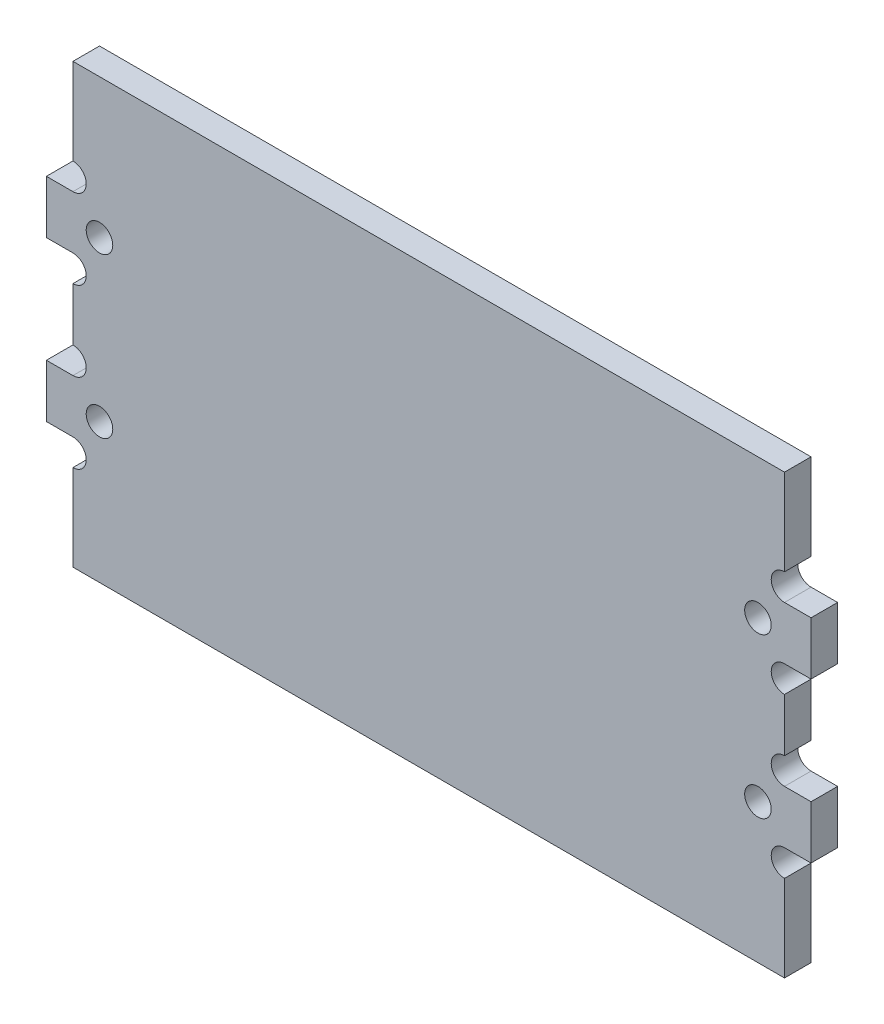
ISO-10303-21;
HEADER;
FILE_DESCRIPTION(('STEP AP214'),'2;1');
FILE_NAME('part.step','',(''),(''),'','','');
FILE_SCHEMA(('AUTOMOTIVE_DESIGN { 1 0 10303 214 1 1 1 1 }'));
ENDSEC;
DATA;
#1=APPLICATION_CONTEXT('core data for automotive mechanical design processes');
#2=APPLICATION_PROTOCOL_DEFINITION('international standard','automotive_design',2000,#1);
#3=PRODUCT_CONTEXT('',#1,'mechanical');
#4=PRODUCT('Part','Part','',(#3));
#5=PRODUCT_RELATED_PRODUCT_CATEGORY('part','',(#4));
#6=PRODUCT_DEFINITION_FORMATION('','',#4);
#7=PRODUCT_DEFINITION_CONTEXT('part definition',#1,'design');
#8=PRODUCT_DEFINITION('design','',#6,#7);
#9=PRODUCT_DEFINITION_SHAPE('','',#8);
#10=(LENGTH_UNIT() NAMED_UNIT(*) SI_UNIT(.MILLI.,.METRE.));
#11=(NAMED_UNIT(*) PLANE_ANGLE_UNIT() SI_UNIT($,.RADIAN.));
#12=(NAMED_UNIT(*) SI_UNIT($,.STERADIAN.) SOLID_ANGLE_UNIT());
#13=UNCERTAINTY_MEASURE_WITH_UNIT(LENGTH_MEASURE(1.E-05),#10,'distance_accuracy_value','');
#14=(GEOMETRIC_REPRESENTATION_CONTEXT(3) GLOBAL_UNCERTAINTY_ASSIGNED_CONTEXT((#13)) GLOBAL_UNIT_ASSIGNED_CONTEXT((#10,
#11,#12)) REPRESENTATION_CONTEXT('',''));
#15=CARTESIAN_POINT('',(0.,0.,0.));
#16=DIRECTION('',(0.,0.,1.));
#17=DIRECTION('',(1.,0.,0.));
#18=AXIS2_PLACEMENT_3D('',#15,#16,#17);
#19=CARTESIAN_POINT('',(-29.1615627590224,11.8479591836735,2.));
#20=DIRECTION('',(0.,0.,1.));
#21=DIRECTION('',(1.,0.,0.));
#22=AXIS2_PLACEMENT_3D('',#19,#20,#21);
#23=PLANE('',#22);
#24=CARTESIAN_POINT('',(-27.1615627590224,-3.15204081632653,2.));
#25=DIRECTION('',(0.,0.,1.));
#26=DIRECTION('',(1.,0.,0.));
#27=AXIS2_PLACEMENT_3D('',#24,#25,#26);
#28=CIRCLE('',#27,1.);
#29=CARTESIAN_POINT('',(-26.1615627590224,-3.15204081632653,2.));
#30=VERTEX_POINT('',#29);
#31=EDGE_CURVE('E815',#30,#30,#28,.T.);
#32=ORIENTED_EDGE('',*,*,#31,.F.);
#33=EDGE_LOOP('',(#32));
#34=FACE_BOUND('',#33,.T.);
#35=CARTESIAN_POINT('',(22.4384372409776,8.84795918367347,2.));
#36=DIRECTION('',(0.,0.,1.));
#37=DIRECTION('',(1.,0.,0.));
#38=AXIS2_PLACEMENT_3D('',#35,#36,#37);
#39=CIRCLE('',#38,1.);
#40=CARTESIAN_POINT('',(23.4384372409776,8.84795918367347,2.));
#41=VERTEX_POINT('',#40);
#42=EDGE_CURVE('E251',#41,#41,#39,.T.);
#43=ORIENTED_EDGE('',*,*,#42,.F.);
#44=EDGE_LOOP('',(#43));
#45=FACE_BOUND('',#44,.T.);
#46=DIRECTION('',(0.,-1.,0.));
#47=VECTOR('',#46,1.);
#48=CARTESIAN_POINT('',(-29.1615627590224,19.3479591836735,2.));
#49=LINE('',#48,#47);
#50=CARTESIAN_POINT('',(-29.1615627590224,19.3479591836735,2.));
#51=VERTEX_POINT('',#50);
#52=CARTESIAN_POINT('',(-29.1615627590224,12.8479591836735,2.));
#53=VERTEX_POINT('',#52);
#54=EDGE_CURVE('E146',#51,#53,#49,.T.);
#55=ORIENTED_EDGE('',*,*,#54,.T.);
#56=CARTESIAN_POINT('',(-29.1615627590224,11.8479591836735,2.));
#57=DIRECTION('',(0.,0.,-1.));
#58=DIRECTION('',(1.,0.,0.));
#59=AXIS2_PLACEMENT_3D('',#56,#57,#58);
#60=CIRCLE('',#59,1.);
#61=CARTESIAN_POINT('',(-29.1615627590224,10.8479591836735,2.));
#62=VERTEX_POINT('',#61);
#63=EDGE_CURVE('E455',#53,#62,#60,.T.);
#64=ORIENTED_EDGE('',*,*,#63,.T.);
#65=DIRECTION('',(-1.,0.,0.));
#66=VECTOR('',#65,1.);
#67=CARTESIAN_POINT('',(-29.1615627590224,10.8479591836735,2.));
#68=LINE('',#67,#66);
#69=CARTESIAN_POINT('',(-31.1615627590224,10.8479591836735,2.));
#70=VERTEX_POINT('',#69);
#71=EDGE_CURVE('E382',#62,#70,#68,.T.);
#72=ORIENTED_EDGE('',*,*,#71,.T.);
#73=DIRECTION('',(0.,-1.,0.));
#74=VECTOR('',#73,1.);
#75=CARTESIAN_POINT('',(-31.1615627590224,10.8479591836735,2.));
#76=LINE('',#75,#74);
#77=CARTESIAN_POINT('',(-31.1615627590224,6.84795918367347,2.));
#78=VERTEX_POINT('',#77);
#79=EDGE_CURVE('E401',#70,#78,#76,.T.);
#80=ORIENTED_EDGE('',*,*,#79,.T.);
#81=DIRECTION('',(1.,0.,0.));
#82=VECTOR('',#81,1.);
#83=CARTESIAN_POINT('',(-29.1615627590224,6.84795918367347,2.));
#84=LINE('',#83,#82);
#85=CARTESIAN_POINT('',(-29.1615627590224,6.84795918367347,2.));
#86=VERTEX_POINT('',#85);
#87=EDGE_CURVE('E398',#78,#86,#84,.T.);
#88=ORIENTED_EDGE('',*,*,#87,.T.);
#89=CARTESIAN_POINT('',(-29.1615627590224,5.84795918367347,2.));
#90=DIRECTION('',(0.,0.,-1.));
#91=DIRECTION('',(-1.,0.,0.));
#92=AXIS2_PLACEMENT_3D('',#89,#90,#91);
#93=CIRCLE('',#92,1.);
#94=CARTESIAN_POINT('',(-29.1615627590224,4.84795918367347,2.));
#95=VERTEX_POINT('',#94);
#96=EDGE_CURVE('E400',#86,#95,#93,.T.);
#97=ORIENTED_EDGE('',*,*,#96,.T.);
#98=DIRECTION('',(0.,-1.,0.));
#99=VECTOR('',#98,1.);
#100=CARTESIAN_POINT('',(-29.1615627590224,4.84795918367347,2.));
#101=LINE('',#100,#99);
#102=CARTESIAN_POINT('',(-29.1615627590224,0.847959183673475,2.));
#103=VERTEX_POINT('',#102);
#104=EDGE_CURVE('E403',#95,#103,#101,.T.);
#105=ORIENTED_EDGE('',*,*,#104,.T.);
#106=CARTESIAN_POINT('',(-29.1615627590224,-0.152040816326526,2.));
#107=DIRECTION('',(0.,0.,-1.));
#108=DIRECTION('',(1.,0.,0.));
#109=AXIS2_PLACEMENT_3D('',#106,#107,#108);
#110=CIRCLE('',#109,1.);
#111=CARTESIAN_POINT('',(-29.1615627590224,-1.15204081632653,2.));
#112=VERTEX_POINT('',#111);
#113=EDGE_CURVE('E409',#103,#112,#110,.T.);
#114=ORIENTED_EDGE('',*,*,#113,.T.);
#115=DIRECTION('',(-1.,0.,0.));
#116=VECTOR('',#115,1.);
#117=CARTESIAN_POINT('',(-29.1615627590224,-1.15204081632653,2.));
#118=LINE('',#117,#116);
#119=CARTESIAN_POINT('',(-31.1615627590224,-1.15204081632653,2.));
#120=VERTEX_POINT('',#119);
#121=EDGE_CURVE('E411',#112,#120,#118,.T.);
#122=ORIENTED_EDGE('',*,*,#121,.T.);
#123=DIRECTION('',(0.,-1.,0.));
#124=VECTOR('',#123,1.);
#125=CARTESIAN_POINT('',(-31.1615627590224,-1.15204081632653,2.));
#126=LINE('',#125,#124);
#127=CARTESIAN_POINT('',(-31.1615627590224,-5.15204081632653,2.));
#128=VERTEX_POINT('',#127);
#129=EDGE_CURVE('E413',#120,#128,#126,.T.);
#130=ORIENTED_EDGE('',*,*,#129,.T.);
#131=DIRECTION('',(1.,0.,0.));
#132=VECTOR('',#131,1.);
#133=CARTESIAN_POINT('',(-29.1615627590224,-5.15204081632653,2.));
#134=LINE('',#133,#132);
#135=CARTESIAN_POINT('',(-29.1615627590224,-5.15204081632653,2.));
#136=VERTEX_POINT('',#135);
#137=EDGE_CURVE('E415',#128,#136,#134,.T.);
#138=ORIENTED_EDGE('',*,*,#137,.T.);
#139=CARTESIAN_POINT('',(-29.1615627590224,-6.15204081632653,2.));
#140=DIRECTION('',(0.,0.,-1.));
#141=DIRECTION('',(-1.,0.,0.));
#142=AXIS2_PLACEMENT_3D('',#139,#140,#141);
#143=CIRCLE('',#142,1.);
#144=CARTESIAN_POINT('',(-29.1615627590224,-7.15204081632653,2.));
#145=VERTEX_POINT('',#144);
#146=EDGE_CURVE('E417',#136,#145,#143,.T.);
#147=ORIENTED_EDGE('',*,*,#146,.T.);
#148=DIRECTION('',(0.,-1.,0.));
#149=VECTOR('',#148,1.);
#150=CARTESIAN_POINT('',(-29.1615627590224,-7.15204081632653,2.));
#151=LINE('',#150,#149);
#152=CARTESIAN_POINT('',(-29.1615627590224,-13.6520408163265,2.));
#153=VERTEX_POINT('',#152);
#154=EDGE_CURVE('E419',#145,#153,#151,.T.);
#155=ORIENTED_EDGE('',*,*,#154,.T.);
#156=DIRECTION('',(1.,0.,0.));
#157=VECTOR('',#156,1.);
#158=CARTESIAN_POINT('',(-29.1615627590224,-13.6520408163265,2.));
#159=LINE('',#158,#157);
#160=CARTESIAN_POINT('',(24.4384372409776,-13.6520408163265,2.));
#161=VERTEX_POINT('',#160);
#162=EDGE_CURVE('E421',#153,#161,#159,.T.);
#163=ORIENTED_EDGE('',*,*,#162,.T.);
#164=DIRECTION('',(0.,1.,0.));
#165=VECTOR('',#164,1.);
#166=CARTESIAN_POINT('',(24.4384372409776,-12.6520408163265,2.));
#167=LINE('',#166,#165);
#168=CARTESIAN_POINT('',(24.4384372409776,-7.15204081632653,2.));
#169=VERTEX_POINT('',#168);
#170=EDGE_CURVE('E423',#161,#169,#167,.T.);
#171=ORIENTED_EDGE('',*,*,#170,.T.);
#172=CARTESIAN_POINT('',(24.4384372409776,-6.15204081632653,2.));
#173=DIRECTION('',(0.,0.,-1.));
#174=DIRECTION('',(1.,0.,0.));
#175=AXIS2_PLACEMENT_3D('',#172,#173,#174);
#176=CIRCLE('',#175,1.);
#177=CARTESIAN_POINT('',(24.4384372409776,-5.15204081632653,2.));
#178=VERTEX_POINT('',#177);
#179=EDGE_CURVE('E425',#169,#178,#176,.T.);
#180=ORIENTED_EDGE('',*,*,#179,.T.);
#181=DIRECTION('',(1.,0.,0.));
#182=VECTOR('',#181,1.);
#183=CARTESIAN_POINT('',(24.4384372409776,-5.15204081632653,2.));
#184=LINE('',#183,#182);
#185=CARTESIAN_POINT('',(26.4384372409776,-5.15204081632653,2.));
#186=VERTEX_POINT('',#185);
#187=EDGE_CURVE('E427',#178,#186,#184,.T.);
#188=ORIENTED_EDGE('',*,*,#187,.T.);
#189=DIRECTION('',(0.,1.,0.));
#190=VECTOR('',#189,1.);
#191=CARTESIAN_POINT('',(26.4384372409776,-1.15204081632653,2.));
#192=LINE('',#191,#190);
#193=CARTESIAN_POINT('',(26.4384372409776,-1.15204081632653,2.));
#194=VERTEX_POINT('',#193);
#195=EDGE_CURVE('E429',#186,#194,#192,.T.);
#196=ORIENTED_EDGE('',*,*,#195,.T.);
#197=DIRECTION('',(-1.,0.,0.));
#198=VECTOR('',#197,1.);
#199=CARTESIAN_POINT('',(24.4384372409776,-1.15204081632653,2.));
#200=LINE('',#199,#198);
#201=CARTESIAN_POINT('',(24.4384372409776,-1.15204081632653,2.));
#202=VERTEX_POINT('',#201);
#203=EDGE_CURVE('E431',#194,#202,#200,.T.);
#204=ORIENTED_EDGE('',*,*,#203,.T.);
#205=CARTESIAN_POINT('',(24.4384372409776,-0.152040816326526,2.));
#206=DIRECTION('',(0.,0.,-1.));
#207=DIRECTION('',(-1.,0.,0.));
#208=AXIS2_PLACEMENT_3D('',#205,#206,#207);
#209=CIRCLE('',#208,1.);
#210=CARTESIAN_POINT('',(24.4384372409776,0.847959183673475,2.));
#211=VERTEX_POINT('',#210);
#212=EDGE_CURVE('E433',#202,#211,#209,.T.);
#213=ORIENTED_EDGE('',*,*,#212,.T.);
#214=DIRECTION('',(0.,1.,0.));
#215=VECTOR('',#214,1.);
#216=CARTESIAN_POINT('',(24.4384372409776,4.84795918367347,2.));
#217=LINE('',#216,#215);
#218=CARTESIAN_POINT('',(24.4384372409776,4.84795918367347,2.));
#219=VERTEX_POINT('',#218);
#220=EDGE_CURVE('E435',#211,#219,#217,.T.);
#221=ORIENTED_EDGE('',*,*,#220,.T.);
#222=CARTESIAN_POINT('',(24.4384372409776,5.84795918367347,2.));
#223=DIRECTION('',(0.,0.,-1.));
#224=DIRECTION('',(1.,0.,0.));
#225=AXIS2_PLACEMENT_3D('',#222,#223,#224);
#226=CIRCLE('',#225,1.);
#227=CARTESIAN_POINT('',(24.4384372409776,6.84795918367347,2.));
#228=VERTEX_POINT('',#227);
#229=EDGE_CURVE('E437',#219,#228,#226,.T.);
#230=ORIENTED_EDGE('',*,*,#229,.T.);
#231=DIRECTION('',(1.,0.,0.));
#232=VECTOR('',#231,1.);
#233=CARTESIAN_POINT('',(24.4384372409776,6.84795918367347,2.));
#234=LINE('',#233,#232);
#235=CARTESIAN_POINT('',(26.4384372409776,6.84795918367347,2.));
#236=VERTEX_POINT('',#235);
#237=EDGE_CURVE('E439',#228,#236,#234,.T.);
#238=ORIENTED_EDGE('',*,*,#237,.T.);
#239=DIRECTION('',(0.,1.,0.));
#240=VECTOR('',#239,1.);
#241=CARTESIAN_POINT('',(26.4384372409776,10.8479591836735,2.));
#242=LINE('',#241,#240);
#243=CARTESIAN_POINT('',(26.4384372409776,10.8479591836735,2.));
#244=VERTEX_POINT('',#243);
#245=EDGE_CURVE('E441',#236,#244,#242,.T.);
#246=ORIENTED_EDGE('',*,*,#245,.T.);
#247=DIRECTION('',(-1.,0.,0.));
#248=VECTOR('',#247,1.);
#249=CARTESIAN_POINT('',(24.4384372409776,10.8479591836735,2.));
#250=LINE('',#249,#248);
#251=CARTESIAN_POINT('',(24.4384372409776,10.8479591836735,2.));
#252=VERTEX_POINT('',#251);
#253=EDGE_CURVE('E227',#244,#252,#250,.T.);
#254=ORIENTED_EDGE('',*,*,#253,.T.);
#255=CARTESIAN_POINT('',(24.4384372409776,11.8479591836735,2.));
#256=DIRECTION('',(0.,0.,-1.));
#257=DIRECTION('',(-1.,0.,0.));
#258=AXIS2_PLACEMENT_3D('',#255,#256,#257);
#259=CIRCLE('',#258,1.);
#260=CARTESIAN_POINT('',(24.4384372409776,12.8479591836735,2.));
#261=VERTEX_POINT('',#260);
#262=EDGE_CURVE('E220',#252,#261,#259,.T.);
#263=ORIENTED_EDGE('',*,*,#262,.T.);
#264=DIRECTION('',(0.,1.,0.));
#265=VECTOR('',#264,1.);
#266=CARTESIAN_POINT('',(24.4384372409776,18.3479591836735,2.));
#267=LINE('',#266,#265);
#268=CARTESIAN_POINT('',(24.4384372409776,19.3479591836735,2.));
#269=VERTEX_POINT('',#268);
#270=EDGE_CURVE('E224',#261,#269,#267,.T.);
#271=ORIENTED_EDGE('',*,*,#270,.T.);
#272=DIRECTION('',(-1.,0.,0.));
#273=VECTOR('',#272,1.);
#274=CARTESIAN_POINT('',(23.4384372409776,19.3479591836735,2.));
#275=LINE('',#274,#273);
#276=EDGE_CURVE('E49',#269,#51,#275,.T.);
#277=ORIENTED_EDGE('',*,*,#276,.T.);
#278=EDGE_LOOP('',(#55,#64,#72,#80,#88,#97,#105,#114,#122,#130,#138,#147,#155,#163,#171,#180,
#188,#196,#204,#213,#221,#230,#238,#246,#254,#263,#271,#277));
#279=FACE_BOUND('',#278,.T.);
#280=CARTESIAN_POINT('',(-27.1615627590224,8.84795918367347,2.));
#281=DIRECTION('',(0.,0.,1.));
#282=DIRECTION('',(1.,0.,0.));
#283=AXIS2_PLACEMENT_3D('',#280,#281,#282);
#284=CIRCLE('',#283,1.);
#285=CARTESIAN_POINT('',(-26.1615627590224,8.84795918367347,2.));
#286=VERTEX_POINT('',#285);
#287=EDGE_CURVE('E821',#286,#286,#284,.T.);
#288=ORIENTED_EDGE('',*,*,#287,.F.);
#289=EDGE_LOOP('',(#288));
#290=FACE_BOUND('',#289,.T.);
#291=CARTESIAN_POINT('',(22.4384372409776,-3.15204081632653,2.));
#292=DIRECTION('',(0.,0.,1.));
#293=DIRECTION('',(1.,0.,0.));
#294=AXIS2_PLACEMENT_3D('',#291,#292,#293);
#295=CIRCLE('',#294,1.);
#296=CARTESIAN_POINT('',(23.4384372409776,-3.15204081632653,2.));
#297=VERTEX_POINT('',#296);
#298=EDGE_CURVE('E806',#297,#297,#295,.T.);
#299=ORIENTED_EDGE('',*,*,#298,.F.);
#300=EDGE_LOOP('',(#299));
#301=FACE_BOUND('',#300,.T.);
#302=ADVANCED_FACE('F32',(#34,#45,#279,#290,#301),#23,.T.);
#303=CARTESIAN_POINT('',(-29.1615627590224,11.8479591836735,0.));
#304=DIRECTION('',(0.,0.,1.));
#305=DIRECTION('',(1.,0.,0.));
#306=AXIS2_PLACEMENT_3D('',#303,#304,#305);
#307=PLANE('',#306);
#308=DIRECTION('',(0.,-1.,0.));
#309=VECTOR('',#308,1.);
#310=CARTESIAN_POINT('',(-29.1615627590224,18.3479591836735,0.));
#311=LINE('',#310,#309);
#312=CARTESIAN_POINT('',(-29.1615627590224,19.3479591836735,0.));
#313=VERTEX_POINT('',#312);
#314=CARTESIAN_POINT('',(-29.1615627590224,12.8479591836735,0.));
#315=VERTEX_POINT('',#314);
#316=EDGE_CURVE('E141',#313,#315,#311,.T.);
#317=ORIENTED_EDGE('',*,*,#316,.F.);
#318=DIRECTION('',(-1.,0.,0.));
#319=VECTOR('',#318,1.);
#320=CARTESIAN_POINT('',(-28.1615627590224,19.3479591836735,0.));
#321=LINE('',#320,#319);
#322=CARTESIAN_POINT('',(24.4384372409776,19.3479591836735,0.));
#323=VERTEX_POINT('',#322);
#324=EDGE_CURVE('E137',#323,#313,#321,.T.);
#325=ORIENTED_EDGE('',*,*,#324,.F.);
#326=DIRECTION('',(0.,1.,0.));
#327=VECTOR('',#326,1.);
#328=CARTESIAN_POINT('',(24.4384372409776,19.3479591836735,0.));
#329=LINE('',#328,#327);
#330=CARTESIAN_POINT('',(24.4384372409776,12.8479591836735,0.));
#331=VERTEX_POINT('',#330);
#332=EDGE_CURVE('E303',#331,#323,#329,.T.);
#333=ORIENTED_EDGE('',*,*,#332,.F.);
#334=CARTESIAN_POINT('',(24.4384372409776,11.8479591836735,0.));
#335=DIRECTION('',(0.,0.,-1.));
#336=DIRECTION('',(-1.,0.,0.));
#337=AXIS2_PLACEMENT_3D('',#334,#335,#336);
#338=CIRCLE('',#337,1.);
#339=CARTESIAN_POINT('',(24.4384372409776,10.8479591836735,0.));
#340=VERTEX_POINT('',#339);
#341=EDGE_CURVE('E237',#340,#331,#338,.T.);
#342=ORIENTED_EDGE('',*,*,#341,.F.);
#343=DIRECTION('',(-1.,0.,0.));
#344=VECTOR('',#343,1.);
#345=CARTESIAN_POINT('',(24.4384372409776,10.8479591836735,0.));
#346=LINE('',#345,#344);
#347=CARTESIAN_POINT('',(26.4384372409776,10.8479591836735,0.));
#348=VERTEX_POINT('',#347);
#349=EDGE_CURVE('E300',#348,#340,#346,.T.);
#350=ORIENTED_EDGE('',*,*,#349,.F.);
#351=DIRECTION('',(0.,1.,0.));
#352=VECTOR('',#351,1.);
#353=CARTESIAN_POINT('',(26.4384372409776,10.8479591836735,0.));
#354=LINE('',#353,#352);
#355=CARTESIAN_POINT('',(26.4384372409776,6.84795918367347,0.));
#356=VERTEX_POINT('',#355);
#357=EDGE_CURVE('E298',#356,#348,#354,.T.);
#358=ORIENTED_EDGE('',*,*,#357,.F.);
#359=DIRECTION('',(1.,0.,0.));
#360=VECTOR('',#359,1.);
#361=CARTESIAN_POINT('',(24.4384372409776,6.84795918367347,0.));
#362=LINE('',#361,#360);
#363=CARTESIAN_POINT('',(24.4384372409776,6.84795918367347,0.));
#364=VERTEX_POINT('',#363);
#365=EDGE_CURVE('E296',#364,#356,#362,.T.);
#366=ORIENTED_EDGE('',*,*,#365,.F.);
#367=CARTESIAN_POINT('',(24.4384372409776,5.84795918367347,0.));
#368=DIRECTION('',(0.,0.,-1.));
#369=DIRECTION('',(1.,0.,0.));
#370=AXIS2_PLACEMENT_3D('',#367,#368,#369);
#371=CIRCLE('',#370,1.);
#372=CARTESIAN_POINT('',(24.4384372409776,4.84795918367347,0.));
#373=VERTEX_POINT('',#372);
#374=EDGE_CURVE('E294',#373,#364,#371,.T.);
#375=ORIENTED_EDGE('',*,*,#374,.F.);
#376=DIRECTION('',(0.,1.,0.));
#377=VECTOR('',#376,1.);
#378=CARTESIAN_POINT('',(24.4384372409776,4.84795918367347,0.));
#379=LINE('',#378,#377);
#380=CARTESIAN_POINT('',(24.4384372409776,0.847959183673475,0.));
#381=VERTEX_POINT('',#380);
#382=EDGE_CURVE('E292',#381,#373,#379,.T.);
#383=ORIENTED_EDGE('',*,*,#382,.F.);
#384=CARTESIAN_POINT('',(24.4384372409776,-0.152040816326526,0.));
#385=DIRECTION('',(0.,0.,-1.));
#386=DIRECTION('',(-1.,0.,0.));
#387=AXIS2_PLACEMENT_3D('',#384,#385,#386);
#388=CIRCLE('',#387,1.);
#389=CARTESIAN_POINT('',(24.4384372409776,-1.15204081632653,0.));
#390=VERTEX_POINT('',#389);
#391=EDGE_CURVE('E290',#390,#381,#388,.T.);
#392=ORIENTED_EDGE('',*,*,#391,.F.);
#393=DIRECTION('',(-1.,0.,0.));
#394=VECTOR('',#393,1.);
#395=CARTESIAN_POINT('',(24.4384372409776,-1.15204081632653,0.));
#396=LINE('',#395,#394);
#397=CARTESIAN_POINT('',(26.4384372409776,-1.15204081632653,0.));
#398=VERTEX_POINT('',#397);
#399=EDGE_CURVE('E288',#398,#390,#396,.T.);
#400=ORIENTED_EDGE('',*,*,#399,.F.);
#401=DIRECTION('',(0.,1.,0.));
#402=VECTOR('',#401,1.);
#403=CARTESIAN_POINT('',(26.4384372409776,-1.15204081632653,0.));
#404=LINE('',#403,#402);
#405=CARTESIAN_POINT('',(26.4384372409776,-5.15204081632653,0.));
#406=VERTEX_POINT('',#405);
#407=EDGE_CURVE('E286',#406,#398,#404,.T.);
#408=ORIENTED_EDGE('',*,*,#407,.F.);
#409=DIRECTION('',(1.,0.,0.));
#410=VECTOR('',#409,1.);
#411=CARTESIAN_POINT('',(24.4384372409776,-5.15204081632653,0.));
#412=LINE('',#411,#410);
#413=CARTESIAN_POINT('',(24.4384372409776,-5.15204081632653,0.));
#414=VERTEX_POINT('',#413);
#415=EDGE_CURVE('E284',#414,#406,#412,.T.);
#416=ORIENTED_EDGE('',*,*,#415,.F.);
#417=CARTESIAN_POINT('',(24.4384372409776,-6.15204081632653,0.));
#418=DIRECTION('',(0.,0.,-1.));
#419=DIRECTION('',(1.,0.,0.));
#420=AXIS2_PLACEMENT_3D('',#417,#418,#419);
#421=CIRCLE('',#420,1.);
#422=CARTESIAN_POINT('',(24.4384372409776,-7.15204081632653,0.));
#423=VERTEX_POINT('',#422);
#424=EDGE_CURVE('E282',#423,#414,#421,.T.);
#425=ORIENTED_EDGE('',*,*,#424,.F.);
#426=DIRECTION('',(0.,1.,0.));
#427=VECTOR('',#426,1.);
#428=CARTESIAN_POINT('',(24.4384372409776,-7.15204081632653,0.));
#429=LINE('',#428,#427);
#430=CARTESIAN_POINT('',(24.4384372409776,-13.6520408163265,0.));
#431=VERTEX_POINT('',#430);
#432=EDGE_CURVE('E280',#431,#423,#429,.T.);
#433=ORIENTED_EDGE('',*,*,#432,.F.);
#434=DIRECTION('',(1.,0.,0.));
#435=VECTOR('',#434,1.);
#436=CARTESIAN_POINT('',(24.4384372409776,-13.6520408163265,0.));
#437=LINE('',#436,#435);
#438=CARTESIAN_POINT('',(-29.1615627590224,-13.6520408163265,0.));
#439=VERTEX_POINT('',#438);
#440=EDGE_CURVE('E277',#439,#431,#437,.T.);
#441=ORIENTED_EDGE('',*,*,#440,.F.);
#442=DIRECTION('',(0.,-1.,0.));
#443=VECTOR('',#442,1.);
#444=CARTESIAN_POINT('',(-29.1615627590224,-12.6520408163265,0.));
#445=LINE('',#444,#443);
#446=CARTESIAN_POINT('',(-29.1615627590224,-7.15204081632653,0.));
#447=VERTEX_POINT('',#446);
#448=EDGE_CURVE('E274',#447,#439,#445,.T.);
#449=ORIENTED_EDGE('',*,*,#448,.F.);
#450=CARTESIAN_POINT('',(-29.1615627590224,-6.15204081632653,0.));
#451=DIRECTION('',(0.,0.,-1.));
#452=DIRECTION('',(-1.,0.,0.));
#453=AXIS2_PLACEMENT_3D('',#450,#451,#452);
#454=CIRCLE('',#453,1.);
#455=CARTESIAN_POINT('',(-29.1615627590224,-5.15204081632653,0.));
#456=VERTEX_POINT('',#455);
#457=EDGE_CURVE('E271',#456,#447,#454,.T.);
#458=ORIENTED_EDGE('',*,*,#457,.F.);
#459=DIRECTION('',(1.,0.,0.));
#460=VECTOR('',#459,1.);
#461=CARTESIAN_POINT('',(-29.1615627590224,-5.15204081632653,0.));
#462=LINE('',#461,#460);
#463=CARTESIAN_POINT('',(-31.1615627590224,-5.15204081632653,0.));
#464=VERTEX_POINT('',#463);
#465=EDGE_CURVE('E269',#464,#456,#462,.T.);
#466=ORIENTED_EDGE('',*,*,#465,.F.);
#467=DIRECTION('',(0.,-1.,0.));
#468=VECTOR('',#467,1.);
#469=CARTESIAN_POINT('',(-31.1615627590224,-1.15204081632653,0.));
#470=LINE('',#469,#468);
#471=CARTESIAN_POINT('',(-31.1615627590224,-1.15204081632653,0.));
#472=VERTEX_POINT('',#471);
#473=EDGE_CURVE('E267',#472,#464,#470,.T.);
#474=ORIENTED_EDGE('',*,*,#473,.F.);
#475=DIRECTION('',(-1.,0.,0.));
#476=VECTOR('',#475,1.);
#477=CARTESIAN_POINT('',(-29.1615627590224,-1.15204081632653,0.));
#478=LINE('',#477,#476);
#479=CARTESIAN_POINT('',(-29.1615627590224,-1.15204081632653,0.));
#480=VERTEX_POINT('',#479);
#481=EDGE_CURVE('E265',#480,#472,#478,.T.);
#482=ORIENTED_EDGE('',*,*,#481,.F.);
#483=CARTESIAN_POINT('',(-29.1615627590224,-0.152040816326526,0.));
#484=DIRECTION('',(0.,0.,-1.));
#485=DIRECTION('',(1.,0.,0.));
#486=AXIS2_PLACEMENT_3D('',#483,#484,#485);
#487=CIRCLE('',#486,1.);
#488=CARTESIAN_POINT('',(-29.1615627590224,0.847959183673475,0.));
#489=VERTEX_POINT('',#488);
#490=EDGE_CURVE('E263',#489,#480,#487,.T.);
#491=ORIENTED_EDGE('',*,*,#490,.F.);
#492=DIRECTION('',(0.,-1.,0.));
#493=VECTOR('',#492,1.);
#494=CARTESIAN_POINT('',(-29.1615627590224,4.84795918367347,0.));
#495=LINE('',#494,#493);
#496=CARTESIAN_POINT('',(-29.1615627590224,4.84795918367347,0.));
#497=VERTEX_POINT('',#496);
#498=EDGE_CURVE('E261',#497,#489,#495,.T.);
#499=ORIENTED_EDGE('',*,*,#498,.F.);
#500=CARTESIAN_POINT('',(-29.1615627590224,5.84795918367347,0.));
#501=DIRECTION('',(0.,0.,-1.));
#502=DIRECTION('',(-1.,0.,0.));
#503=AXIS2_PLACEMENT_3D('',#500,#501,#502);
#504=CIRCLE('',#503,1.);
#505=CARTESIAN_POINT('',(-29.1615627590224,6.84795918367347,0.));
#506=VERTEX_POINT('',#505);
#507=EDGE_CURVE('E259',#506,#497,#504,.T.);
#508=ORIENTED_EDGE('',*,*,#507,.F.);
#509=DIRECTION('',(1.,0.,0.));
#510=VECTOR('',#509,1.);
#511=CARTESIAN_POINT('',(-29.1615627590224,6.84795918367347,0.));
#512=LINE('',#511,#510);
#513=CARTESIAN_POINT('',(-31.1615627590224,6.84795918367347,0.));
#514=VERTEX_POINT('',#513);
#515=EDGE_CURVE('E257',#514,#506,#512,.T.);
#516=ORIENTED_EDGE('',*,*,#515,.F.);
#517=DIRECTION('',(0.,-1.,0.));
#518=VECTOR('',#517,1.);
#519=CARTESIAN_POINT('',(-31.1615627590224,10.8479591836735,0.));
#520=LINE('',#519,#518);
#521=CARTESIAN_POINT('',(-31.1615627590224,10.8479591836735,0.));
#522=VERTEX_POINT('',#521);
#523=EDGE_CURVE('E255',#522,#514,#520,.T.);
#524=ORIENTED_EDGE('',*,*,#523,.F.);
#525=DIRECTION('',(-1.,0.,0.));
#526=VECTOR('',#525,1.);
#527=CARTESIAN_POINT('',(-29.1615627590224,10.8479591836735,0.));
#528=LINE('',#527,#526);
#529=CARTESIAN_POINT('',(-29.1615627590224,10.8479591836735,0.));
#530=VERTEX_POINT('',#529);
#531=EDGE_CURVE('E253',#530,#522,#528,.T.);
#532=ORIENTED_EDGE('',*,*,#531,.F.);
#533=CARTESIAN_POINT('',(-29.1615627590224,11.8479591836735,0.));
#534=DIRECTION('',(0.,0.,-1.));
#535=DIRECTION('',(1.,0.,0.));
#536=AXIS2_PLACEMENT_3D('',#533,#534,#535);
#537=CIRCLE('',#536,1.);
#538=EDGE_CURVE('E250',#315,#530,#537,.T.);
#539=ORIENTED_EDGE('',*,*,#538,.F.);
#540=EDGE_LOOP('',(#317,#325,#333,#342,#350,#358,#366,#375,#383,#392,#400,#408,#416,#425,#433,
#441,#449,#458,#466,#474,#482,#491,#499,#508,#516,#524,#532,#539));
#541=FACE_BOUND('',#540,.T.);
#542=CARTESIAN_POINT('',(22.4384372409776,8.84795918367347,0.));
#543=DIRECTION('',(0.,0.,1.));
#544=DIRECTION('',(1.,0.,0.));
#545=AXIS2_PLACEMENT_3D('',#542,#543,#544);
#546=CIRCLE('',#545,1.);
#547=CARTESIAN_POINT('',(23.4384372409776,8.84795918367347,0.));
#548=VERTEX_POINT('',#547);
#549=EDGE_CURVE('E459',#548,#548,#546,.T.);
#550=ORIENTED_EDGE('',*,*,#549,.T.);
#551=EDGE_LOOP('',(#550));
#552=FACE_BOUND('',#551,.T.);
#553=CARTESIAN_POINT('',(-27.1615627590224,8.84795918367347,0.));
#554=DIRECTION('',(0.,0.,1.));
#555=DIRECTION('',(1.,0.,0.));
#556=AXIS2_PLACEMENT_3D('',#553,#554,#555);
#557=CIRCLE('',#556,1.);
#558=CARTESIAN_POINT('',(-26.1615627590224,8.84795918367347,0.));
#559=VERTEX_POINT('',#558);
#560=EDGE_CURVE('E818',#559,#559,#557,.T.);
#561=ORIENTED_EDGE('',*,*,#560,.T.);
#562=EDGE_LOOP('',(#561));
#563=FACE_BOUND('',#562,.T.);
#564=CARTESIAN_POINT('',(-27.1615627590224,-3.15204081632653,0.));
#565=DIRECTION('',(0.,0.,1.));
#566=DIRECTION('',(1.,0.,0.));
#567=AXIS2_PLACEMENT_3D('',#564,#565,#566);
#568=CIRCLE('',#567,1.);
#569=CARTESIAN_POINT('',(-26.1615627590224,-3.15204081632653,0.));
#570=VERTEX_POINT('',#569);
#571=EDGE_CURVE('E812',#570,#570,#568,.T.);
#572=ORIENTED_EDGE('',*,*,#571,.T.);
#573=EDGE_LOOP('',(#572));
#574=FACE_BOUND('',#573,.T.);
#575=CARTESIAN_POINT('',(22.4384372409776,-3.15204081632653,0.));
#576=DIRECTION('',(0.,0.,1.));
#577=DIRECTION('',(1.,0.,0.));
#578=AXIS2_PLACEMENT_3D('',#575,#576,#577);
#579=CIRCLE('',#578,1.);
#580=CARTESIAN_POINT('',(23.4384372409776,-3.15204081632653,0.));
#581=VERTEX_POINT('',#580);
#582=EDGE_CURVE('E809',#581,#581,#579,.T.);
#583=ORIENTED_EDGE('',*,*,#582,.T.);
#584=EDGE_LOOP('',(#583));
#585=FACE_BOUND('',#584,.T.);
#586=ADVANCED_FACE('F386',(#541,#552,#563,#574,#585),#307,.F.);
#587=CARTESIAN_POINT('',(-29.1615627590224,18.3479591836735,2.));
#588=DIRECTION('',(1.,0.,0.));
#589=DIRECTION('',(0.,1.,0.));
#590=AXIS2_PLACEMENT_3D('',#587,#588,#589);
#591=PLANE('',#590);
#592=ORIENTED_EDGE('',*,*,#316,.T.);
#593=DIRECTION('',(0.,0.,-1.));
#594=VECTOR('',#593,1.);
#595=CARTESIAN_POINT('',(-29.1615627590224,12.8479591836735,2.));
#596=LINE('',#595,#594);
#597=EDGE_CURVE('E11',#53,#315,#596,.T.);
#598=ORIENTED_EDGE('',*,*,#597,.F.);
#599=ORIENTED_EDGE('',*,*,#54,.F.);
#600=DIRECTION('',(0.,0.,-1.));
#601=VECTOR('',#600,1.);
#602=CARTESIAN_POINT('',(-29.1615627590224,19.3479591836735,2.));
#603=LINE('',#602,#601);
#604=EDGE_CURVE('E245',#51,#313,#603,.T.);
#605=ORIENTED_EDGE('',*,*,#604,.T.);
#606=EDGE_LOOP('',(#592,#598,#599,#605));
#607=FACE_BOUND('',#606,.T.);
#608=ADVANCED_FACE('F34',(#607),#591,.F.);
#609=CARTESIAN_POINT('',(-29.1615627590224,11.8479591836735,2.));
#610=DIRECTION('',(0.,0.,-1.));
#611=DIRECTION('',(-1.,0.,0.));
#612=AXIS2_PLACEMENT_3D('',#609,#610,#611);
#613=CYLINDRICAL_SURFACE('',#612,1.);
#614=ORIENTED_EDGE('',*,*,#538,.T.);
#615=DIRECTION('',(0.,0.,-1.));
#616=VECTOR('',#615,1.);
#617=CARTESIAN_POINT('',(-29.1615627590224,10.8479591836735,2.));
#618=LINE('',#617,#616);
#619=EDGE_CURVE('E41',#62,#530,#618,.T.);
#620=ORIENTED_EDGE('',*,*,#619,.F.);
#621=ORIENTED_EDGE('',*,*,#63,.F.);
#622=ORIENTED_EDGE('',*,*,#597,.T.);
#623=EDGE_LOOP('',(#614,#620,#621,#622));
#624=FACE_BOUND('',#623,.T.);
#625=ADVANCED_FACE('F461',(#624),#613,.F.);
#626=CARTESIAN_POINT('',(-29.1615627590224,10.8479591836735,2.));
#627=DIRECTION('',(0.,-1.,0.));
#628=DIRECTION('',(0.,0.,-1.));
#629=AXIS2_PLACEMENT_3D('',#626,#627,#628);
#630=PLANE('',#629);
#631=ORIENTED_EDGE('',*,*,#531,.T.);
#632=DIRECTION('',(0.,0.,-1.));
#633=VECTOR('',#632,1.);
#634=CARTESIAN_POINT('',(-31.1615627590224,10.8479591836735,2.));
#635=LINE('',#634,#633);
#636=EDGE_CURVE('E373',#70,#522,#635,.T.);
#637=ORIENTED_EDGE('',*,*,#636,.F.);
#638=ORIENTED_EDGE('',*,*,#71,.F.);
#639=ORIENTED_EDGE('',*,*,#619,.T.);
#640=EDGE_LOOP('',(#631,#637,#638,#639));
#641=FACE_BOUND('',#640,.T.);
#642=ADVANCED_FACE('F380',(#641),#630,.F.);
#643=CARTESIAN_POINT('',(-31.1615627590224,10.8479591836735,2.));
#644=DIRECTION('',(1.,0.,0.));
#645=DIRECTION('',(0.,0.,-1.));
#646=AXIS2_PLACEMENT_3D('',#643,#644,#645);
#647=PLANE('',#646);
#648=ORIENTED_EDGE('',*,*,#523,.T.);
#649=DIRECTION('',(0.,0.,-1.));
#650=VECTOR('',#649,1.);
#651=CARTESIAN_POINT('',(-31.1615627590224,6.84795918367347,2.));
#652=LINE('',#651,#650);
#653=EDGE_CURVE('E370',#78,#514,#652,.T.);
#654=ORIENTED_EDGE('',*,*,#653,.F.);
#655=ORIENTED_EDGE('',*,*,#79,.F.);
#656=ORIENTED_EDGE('',*,*,#636,.T.);
#657=EDGE_LOOP('',(#648,#654,#655,#656));
#658=FACE_BOUND('',#657,.T.);
#659=ADVANCED_FACE('F392',(#658),#647,.F.);
#660=CARTESIAN_POINT('',(-29.1615627590224,6.84795918367347,2.));
#661=DIRECTION('',(0.,1.,0.));
#662=DIRECTION('',(0.,0.,1.));
#663=AXIS2_PLACEMENT_3D('',#660,#661,#662);
#664=PLANE('',#663);
#665=ORIENTED_EDGE('',*,*,#515,.T.);
#666=DIRECTION('',(0.,0.,-1.));
#667=VECTOR('',#666,1.);
#668=CARTESIAN_POINT('',(-29.1615627590224,6.84795918367347,2.));
#669=LINE('',#668,#667);
#670=EDGE_CURVE('E367',#86,#506,#669,.T.);
#671=ORIENTED_EDGE('',*,*,#670,.F.);
#672=ORIENTED_EDGE('',*,*,#87,.F.);
#673=ORIENTED_EDGE('',*,*,#653,.T.);
#674=EDGE_LOOP('',(#665,#671,#672,#673));
#675=FACE_BOUND('',#674,.T.);
#676=ADVANCED_FACE('F396',(#675),#664,.F.);
#677=CARTESIAN_POINT('',(-29.1615627590224,5.84795918367347,2.));
#678=DIRECTION('',(0.,0.,-1.));
#679=DIRECTION('',(-1.,0.,0.));
#680=AXIS2_PLACEMENT_3D('',#677,#678,#679);
#681=CYLINDRICAL_SURFACE('',#680,1.);
#682=ORIENTED_EDGE('',*,*,#507,.T.);
#683=DIRECTION('',(0.,0.,-1.));
#684=VECTOR('',#683,1.);
#685=CARTESIAN_POINT('',(-29.1615627590224,4.84795918367347,2.));
#686=LINE('',#685,#684);
#687=EDGE_CURVE('E364',#95,#497,#686,.T.);
#688=ORIENTED_EDGE('',*,*,#687,.F.);
#689=ORIENTED_EDGE('',*,*,#96,.F.);
#690=ORIENTED_EDGE('',*,*,#670,.T.);
#691=EDGE_LOOP('',(#682,#688,#689,#690));
#692=FACE_BOUND('',#691,.T.);
#693=ADVANCED_FACE('F558',(#692),#681,.F.);
#694=CARTESIAN_POINT('',(-29.1615627590224,4.84795918367347,2.));
#695=DIRECTION('',(1.,0.,0.));
#696=DIRECTION('',(0.,1.,0.));
#697=AXIS2_PLACEMENT_3D('',#694,#695,#696);
#698=PLANE('',#697);
#699=ORIENTED_EDGE('',*,*,#498,.T.);
#700=DIRECTION('',(0.,0.,-1.));
#701=VECTOR('',#700,1.);
#702=CARTESIAN_POINT('',(-29.1615627590224,0.847959183673475,2.));
#703=LINE('',#702,#701);
#704=EDGE_CURVE('E361',#103,#489,#703,.T.);
#705=ORIENTED_EDGE('',*,*,#704,.F.);
#706=ORIENTED_EDGE('',*,*,#104,.F.);
#707=ORIENTED_EDGE('',*,*,#687,.T.);
#708=EDGE_LOOP('',(#699,#705,#706,#707));
#709=FACE_BOUND('',#708,.T.);
#710=ADVANCED_FACE('F554',(#709),#698,.F.);
#711=CARTESIAN_POINT('',(-29.1615627590224,-0.152040816326526,2.));
#712=DIRECTION('',(0.,0.,-1.));
#713=DIRECTION('',(-1.,0.,0.));
#714=AXIS2_PLACEMENT_3D('',#711,#712,#713);
#715=CYLINDRICAL_SURFACE('',#714,1.);
#716=ORIENTED_EDGE('',*,*,#490,.T.);
#717=DIRECTION('',(0.,0.,-1.));
#718=VECTOR('',#717,1.);
#719=CARTESIAN_POINT('',(-29.1615627590224,-1.15204081632653,2.));
#720=LINE('',#719,#718);
#721=EDGE_CURVE('E358',#112,#480,#720,.T.);
#722=ORIENTED_EDGE('',*,*,#721,.F.);
#723=ORIENTED_EDGE('',*,*,#113,.F.);
#724=ORIENTED_EDGE('',*,*,#704,.T.);
#725=EDGE_LOOP('',(#716,#722,#723,#724));
#726=FACE_BOUND('',#725,.T.);
#727=ADVANCED_FACE('F550',(#726),#715,.F.);
#728=CARTESIAN_POINT('',(-29.1615627590224,-1.15204081632653,2.));
#729=DIRECTION('',(0.,-1.,0.));
#730=DIRECTION('',(0.,0.,-1.));
#731=AXIS2_PLACEMENT_3D('',#728,#729,#730);
#732=PLANE('',#731);
#733=ORIENTED_EDGE('',*,*,#481,.T.);
#734=DIRECTION('',(0.,0.,-1.));
#735=VECTOR('',#734,1.);
#736=CARTESIAN_POINT('',(-31.1615627590224,-1.15204081632653,2.));
#737=LINE('',#736,#735);
#738=EDGE_CURVE('E355',#120,#472,#737,.T.);
#739=ORIENTED_EDGE('',*,*,#738,.F.);
#740=ORIENTED_EDGE('',*,*,#121,.F.);
#741=ORIENTED_EDGE('',*,*,#721,.T.);
#742=EDGE_LOOP('',(#733,#739,#740,#741));
#743=FACE_BOUND('',#742,.T.);
#744=ADVANCED_FACE('F546',(#743),#732,.F.);
#745=CARTESIAN_POINT('',(-31.1615627590224,-1.15204081632653,2.));
#746=DIRECTION('',(1.,0.,0.));
#747=DIRECTION('',(0.,0.,-1.));
#748=AXIS2_PLACEMENT_3D('',#745,#746,#747);
#749=PLANE('',#748);
#750=ORIENTED_EDGE('',*,*,#473,.T.);
#751=DIRECTION('',(0.,0.,-1.));
#752=VECTOR('',#751,1.);
#753=CARTESIAN_POINT('',(-31.1615627590224,-5.15204081632653,2.));
#754=LINE('',#753,#752);
#755=EDGE_CURVE('E352',#128,#464,#754,.T.);
#756=ORIENTED_EDGE('',*,*,#755,.F.);
#757=ORIENTED_EDGE('',*,*,#129,.F.);
#758=ORIENTED_EDGE('',*,*,#738,.T.);
#759=EDGE_LOOP('',(#750,#756,#757,#758));
#760=FACE_BOUND('',#759,.T.);
#761=ADVANCED_FACE('F542',(#760),#749,.F.);
#762=CARTESIAN_POINT('',(-29.1615627590224,-5.15204081632653,2.));
#763=DIRECTION('',(0.,1.,0.));
#764=DIRECTION('',(0.,0.,1.));
#765=AXIS2_PLACEMENT_3D('',#762,#763,#764);
#766=PLANE('',#765);
#767=ORIENTED_EDGE('',*,*,#465,.T.);
#768=DIRECTION('',(0.,0.,-1.));
#769=VECTOR('',#768,1.);
#770=CARTESIAN_POINT('',(-29.1615627590224,-5.15204081632653,2.));
#771=LINE('',#770,#769);
#772=EDGE_CURVE('E349',#136,#456,#771,.T.);
#773=ORIENTED_EDGE('',*,*,#772,.F.);
#774=ORIENTED_EDGE('',*,*,#137,.F.);
#775=ORIENTED_EDGE('',*,*,#755,.T.);
#776=EDGE_LOOP('',(#767,#773,#774,#775));
#777=FACE_BOUND('',#776,.T.);
#778=ADVANCED_FACE('F538',(#777),#766,.F.);
#779=CARTESIAN_POINT('',(-29.1615627590224,-6.15204081632653,2.));
#780=DIRECTION('',(0.,0.,-1.));
#781=DIRECTION('',(-1.,0.,0.));
#782=AXIS2_PLACEMENT_3D('',#779,#780,#781);
#783=CYLINDRICAL_SURFACE('',#782,1.);
#784=ORIENTED_EDGE('',*,*,#457,.T.);
#785=DIRECTION('',(0.,0.,-1.));
#786=VECTOR('',#785,1.);
#787=CARTESIAN_POINT('',(-29.1615627590224,-7.15204081632653,2.));
#788=LINE('',#787,#786);
#789=EDGE_CURVE('E346',#145,#447,#788,.T.);
#790=ORIENTED_EDGE('',*,*,#789,.F.);
#791=ORIENTED_EDGE('',*,*,#146,.F.);
#792=ORIENTED_EDGE('',*,*,#772,.T.);
#793=EDGE_LOOP('',(#784,#790,#791,#792));
#794=FACE_BOUND('',#793,.T.);
#795=ADVANCED_FACE('F534',(#794),#783,.F.);
#796=CARTESIAN_POINT('',(-29.1615627590224,-12.6520408163265,2.));
#797=DIRECTION('',(1.,0.,0.));
#798=DIRECTION('',(0.,0.,-1.));
#799=AXIS2_PLACEMENT_3D('',#796,#797,#798);
#800=PLANE('',#799);
#801=ORIENTED_EDGE('',*,*,#448,.T.);
#802=DIRECTION('',(0.,0.,-1.));
#803=VECTOR('',#802,1.);
#804=CARTESIAN_POINT('',(-29.1615627590224,-13.6520408163265,2.));
#805=LINE('',#804,#803);
#806=EDGE_CURVE('E343',#153,#439,#805,.T.);
#807=ORIENTED_EDGE('',*,*,#806,.F.);
#808=ORIENTED_EDGE('',*,*,#154,.F.);
#809=ORIENTED_EDGE('',*,*,#789,.T.);
#810=EDGE_LOOP('',(#801,#807,#808,#809));
#811=FACE_BOUND('',#810,.T.);
#812=ADVANCED_FACE('F530',(#811),#800,.F.);
#813=CARTESIAN_POINT('',(24.4384372409776,-13.6520408163265,2.));
#814=DIRECTION('',(0.,1.,0.));
#815=DIRECTION('',(0.,0.,1.));
#816=AXIS2_PLACEMENT_3D('',#813,#814,#815);
#817=PLANE('',#816);
#818=ORIENTED_EDGE('',*,*,#440,.T.);
#819=DIRECTION('',(0.,0.,-1.));
#820=VECTOR('',#819,1.);
#821=CARTESIAN_POINT('',(24.4384372409776,-13.6520408163265,2.));
#822=LINE('',#821,#820);
#823=EDGE_CURVE('E340',#161,#431,#822,.T.);
#824=ORIENTED_EDGE('',*,*,#823,.F.);
#825=ORIENTED_EDGE('',*,*,#162,.F.);
#826=ORIENTED_EDGE('',*,*,#806,.T.);
#827=EDGE_LOOP('',(#818,#824,#825,#826));
#828=FACE_BOUND('',#827,.T.);
#829=ADVANCED_FACE('F526',(#828),#817,.F.);
#830=CARTESIAN_POINT('',(24.4384372409776,-7.15204081632653,2.));
#831=DIRECTION('',(-1.,0.,0.));
#832=DIRECTION('',(0.,-1.,0.));
#833=AXIS2_PLACEMENT_3D('',#830,#831,#832);
#834=PLANE('',#833);
#835=ORIENTED_EDGE('',*,*,#432,.T.);
#836=DIRECTION('',(0.,0.,-1.));
#837=VECTOR('',#836,1.);
#838=CARTESIAN_POINT('',(24.4384372409776,-7.15204081632653,2.));
#839=LINE('',#838,#837);
#840=EDGE_CURVE('E337',#169,#423,#839,.T.);
#841=ORIENTED_EDGE('',*,*,#840,.F.);
#842=ORIENTED_EDGE('',*,*,#170,.F.);
#843=ORIENTED_EDGE('',*,*,#823,.T.);
#844=EDGE_LOOP('',(#835,#841,#842,#843));
#845=FACE_BOUND('',#844,.T.);
#846=ADVANCED_FACE('F522',(#845),#834,.F.);
#847=CARTESIAN_POINT('',(24.4384372409776,-6.15204081632653,2.));
#848=DIRECTION('',(0.,0.,-1.));
#849=DIRECTION('',(-1.,0.,0.));
#850=AXIS2_PLACEMENT_3D('',#847,#848,#849);
#851=CYLINDRICAL_SURFACE('',#850,1.);
#852=ORIENTED_EDGE('',*,*,#424,.T.);
#853=DIRECTION('',(0.,0.,-1.));
#854=VECTOR('',#853,1.);
#855=CARTESIAN_POINT('',(24.4384372409776,-5.15204081632653,2.));
#856=LINE('',#855,#854);
#857=EDGE_CURVE('E334',#178,#414,#856,.T.);
#858=ORIENTED_EDGE('',*,*,#857,.F.);
#859=ORIENTED_EDGE('',*,*,#179,.F.);
#860=ORIENTED_EDGE('',*,*,#840,.T.);
#861=EDGE_LOOP('',(#852,#858,#859,#860));
#862=FACE_BOUND('',#861,.T.);
#863=ADVANCED_FACE('F518',(#862),#851,.F.);
#864=CARTESIAN_POINT('',(24.4384372409776,-5.15204081632653,2.));
#865=DIRECTION('',(0.,1.,0.));
#866=DIRECTION('',(0.,0.,1.));
#867=AXIS2_PLACEMENT_3D('',#864,#865,#866);
#868=PLANE('',#867);
#869=ORIENTED_EDGE('',*,*,#415,.T.);
#870=DIRECTION('',(0.,0.,-1.));
#871=VECTOR('',#870,1.);
#872=CARTESIAN_POINT('',(26.4384372409776,-5.15204081632653,2.));
#873=LINE('',#872,#871);
#874=EDGE_CURVE('E331',#186,#406,#873,.T.);
#875=ORIENTED_EDGE('',*,*,#874,.F.);
#876=ORIENTED_EDGE('',*,*,#187,.F.);
#877=ORIENTED_EDGE('',*,*,#857,.T.);
#878=EDGE_LOOP('',(#869,#875,#876,#877));
#879=FACE_BOUND('',#878,.T.);
#880=ADVANCED_FACE('F514',(#879),#868,.F.);
#881=CARTESIAN_POINT('',(26.4384372409776,-1.15204081632653,2.));
#882=DIRECTION('',(-1.,0.,0.));
#883=DIRECTION('',(0.,0.,1.));
#884=AXIS2_PLACEMENT_3D('',#881,#882,#883);
#885=PLANE('',#884);
#886=ORIENTED_EDGE('',*,*,#407,.T.);
#887=DIRECTION('',(0.,0.,-1.));
#888=VECTOR('',#887,1.);
#889=CARTESIAN_POINT('',(26.4384372409776,-1.15204081632653,2.));
#890=LINE('',#889,#888);
#891=EDGE_CURVE('E328',#194,#398,#890,.T.);
#892=ORIENTED_EDGE('',*,*,#891,.F.);
#893=ORIENTED_EDGE('',*,*,#195,.F.);
#894=ORIENTED_EDGE('',*,*,#874,.T.);
#895=EDGE_LOOP('',(#886,#892,#893,#894));
#896=FACE_BOUND('',#895,.T.);
#897=ADVANCED_FACE('F510',(#896),#885,.F.);
#898=CARTESIAN_POINT('',(24.4384372409776,-1.15204081632653,2.));
#899=DIRECTION('',(0.,-1.,0.));
#900=DIRECTION('',(0.,0.,-1.));
#901=AXIS2_PLACEMENT_3D('',#898,#899,#900);
#902=PLANE('',#901);
#903=ORIENTED_EDGE('',*,*,#399,.T.);
#904=DIRECTION('',(0.,0.,-1.));
#905=VECTOR('',#904,1.);
#906=CARTESIAN_POINT('',(24.4384372409776,-1.15204081632653,2.));
#907=LINE('',#906,#905);
#908=EDGE_CURVE('E325',#202,#390,#907,.T.);
#909=ORIENTED_EDGE('',*,*,#908,.F.);
#910=ORIENTED_EDGE('',*,*,#203,.F.);
#911=ORIENTED_EDGE('',*,*,#891,.T.);
#912=EDGE_LOOP('',(#903,#909,#910,#911));
#913=FACE_BOUND('',#912,.T.);
#914=ADVANCED_FACE('F506',(#913),#902,.F.);
#915=CARTESIAN_POINT('',(24.4384372409776,-0.152040816326526,2.));
#916=DIRECTION('',(0.,0.,-1.));
#917=DIRECTION('',(-1.,0.,0.));
#918=AXIS2_PLACEMENT_3D('',#915,#916,#917);
#919=CYLINDRICAL_SURFACE('',#918,1.);
#920=ORIENTED_EDGE('',*,*,#391,.T.);
#921=DIRECTION('',(0.,0.,-1.));
#922=VECTOR('',#921,1.);
#923=CARTESIAN_POINT('',(24.4384372409776,0.847959183673475,2.));
#924=LINE('',#923,#922);
#925=EDGE_CURVE('E322',#211,#381,#924,.T.);
#926=ORIENTED_EDGE('',*,*,#925,.F.);
#927=ORIENTED_EDGE('',*,*,#212,.F.);
#928=ORIENTED_EDGE('',*,*,#908,.T.);
#929=EDGE_LOOP('',(#920,#926,#927,#928));
#930=FACE_BOUND('',#929,.T.);
#931=ADVANCED_FACE('F502',(#930),#919,.F.);
#932=CARTESIAN_POINT('',(24.4384372409776,4.84795918367347,2.));
#933=DIRECTION('',(-1.,0.,0.));
#934=DIRECTION('',(0.,-1.,0.));
#935=AXIS2_PLACEMENT_3D('',#932,#933,#934);
#936=PLANE('',#935);
#937=ORIENTED_EDGE('',*,*,#382,.T.);
#938=DIRECTION('',(0.,0.,-1.));
#939=VECTOR('',#938,1.);
#940=CARTESIAN_POINT('',(24.4384372409776,4.84795918367347,2.));
#941=LINE('',#940,#939);
#942=EDGE_CURVE('E319',#219,#373,#941,.T.);
#943=ORIENTED_EDGE('',*,*,#942,.F.);
#944=ORIENTED_EDGE('',*,*,#220,.F.);
#945=ORIENTED_EDGE('',*,*,#925,.T.);
#946=EDGE_LOOP('',(#937,#943,#944,#945));
#947=FACE_BOUND('',#946,.T.);
#948=ADVANCED_FACE('F498',(#947),#936,.F.);
#949=CARTESIAN_POINT('',(24.4384372409776,5.84795918367347,2.));
#950=DIRECTION('',(0.,0.,-1.));
#951=DIRECTION('',(-1.,0.,0.));
#952=AXIS2_PLACEMENT_3D('',#949,#950,#951);
#953=CYLINDRICAL_SURFACE('',#952,1.);
#954=ORIENTED_EDGE('',*,*,#374,.T.);
#955=DIRECTION('',(0.,0.,-1.));
#956=VECTOR('',#955,1.);
#957=CARTESIAN_POINT('',(24.4384372409776,6.84795918367347,2.));
#958=LINE('',#957,#956);
#959=EDGE_CURVE('E316',#228,#364,#958,.T.);
#960=ORIENTED_EDGE('',*,*,#959,.F.);
#961=ORIENTED_EDGE('',*,*,#229,.F.);
#962=ORIENTED_EDGE('',*,*,#942,.T.);
#963=EDGE_LOOP('',(#954,#960,#961,#962));
#964=FACE_BOUND('',#963,.T.);
#965=ADVANCED_FACE('F494',(#964),#953,.F.);
#966=CARTESIAN_POINT('',(24.4384372409776,6.84795918367347,2.));
#967=DIRECTION('',(0.,1.,0.));
#968=DIRECTION('',(0.,0.,1.));
#969=AXIS2_PLACEMENT_3D('',#966,#967,#968);
#970=PLANE('',#969);
#971=ORIENTED_EDGE('',*,*,#365,.T.);
#972=DIRECTION('',(0.,0.,-1.));
#973=VECTOR('',#972,1.);
#974=CARTESIAN_POINT('',(26.4384372409776,6.84795918367347,2.));
#975=LINE('',#974,#973);
#976=EDGE_CURVE('E313',#236,#356,#975,.T.);
#977=ORIENTED_EDGE('',*,*,#976,.F.);
#978=ORIENTED_EDGE('',*,*,#237,.F.);
#979=ORIENTED_EDGE('',*,*,#959,.T.);
#980=EDGE_LOOP('',(#971,#977,#978,#979));
#981=FACE_BOUND('',#980,.T.);
#982=ADVANCED_FACE('F491',(#981),#970,.F.);
#983=CARTESIAN_POINT('',(26.4384372409776,10.8479591836735,2.));
#984=DIRECTION('',(-1.,0.,0.));
#985=DIRECTION('',(0.,0.,1.));
#986=AXIS2_PLACEMENT_3D('',#983,#984,#985);
#987=PLANE('',#986);
#988=ORIENTED_EDGE('',*,*,#357,.T.);
#989=DIRECTION('',(0.,0.,-1.));
#990=VECTOR('',#989,1.);
#991=CARTESIAN_POINT('',(26.4384372409776,10.8479591836735,2.));
#992=LINE('',#991,#990);
#993=EDGE_CURVE('E310',#244,#348,#992,.T.);
#994=ORIENTED_EDGE('',*,*,#993,.F.);
#995=ORIENTED_EDGE('',*,*,#245,.F.);
#996=ORIENTED_EDGE('',*,*,#976,.T.);
#997=EDGE_LOOP('',(#988,#994,#995,#996));
#998=FACE_BOUND('',#997,.T.);
#999=ADVANCED_FACE('F447',(#998),#987,.F.);
#1000=CARTESIAN_POINT('',(24.4384372409776,10.8479591836735,2.));
#1001=DIRECTION('',(0.,-1.,0.));
#1002=DIRECTION('',(0.,0.,-1.));
#1003=AXIS2_PLACEMENT_3D('',#1000,#1001,#1002);
#1004=PLANE('',#1003);
#1005=ORIENTED_EDGE('',*,*,#349,.T.);
#1006=DIRECTION('',(0.,0.,-1.));
#1007=VECTOR('',#1006,1.);
#1008=CARTESIAN_POINT('',(24.4384372409776,10.8479591836735,2.));
#1009=LINE('',#1008,#1007);
#1010=EDGE_CURVE('E239',#252,#340,#1009,.T.);
#1011=ORIENTED_EDGE('',*,*,#1010,.F.);
#1012=ORIENTED_EDGE('',*,*,#253,.F.);
#1013=ORIENTED_EDGE('',*,*,#993,.T.);
#1014=EDGE_LOOP('',(#1005,#1011,#1012,#1013));
#1015=FACE_BOUND('',#1014,.T.);
#1016=ADVANCED_FACE('F451',(#1015),#1004,.F.);
#1017=CARTESIAN_POINT('',(24.4384372409776,11.8479591836735,2.));
#1018=DIRECTION('',(0.,0.,-1.));
#1019=DIRECTION('',(-1.,0.,0.));
#1020=AXIS2_PLACEMENT_3D('',#1017,#1018,#1019);
#1021=CYLINDRICAL_SURFACE('',#1020,1.);
#1022=ORIENTED_EDGE('',*,*,#341,.T.);
#1023=DIRECTION('',(0.,0.,-1.));
#1024=VECTOR('',#1023,1.);
#1025=CARTESIAN_POINT('',(24.4384372409776,12.8479591836735,2.));
#1026=LINE('',#1025,#1024);
#1027=EDGE_CURVE('E234',#261,#331,#1026,.T.);
#1028=ORIENTED_EDGE('',*,*,#1027,.F.);
#1029=ORIENTED_EDGE('',*,*,#262,.F.);
#1030=ORIENTED_EDGE('',*,*,#1010,.T.);
#1031=EDGE_LOOP('',(#1022,#1028,#1029,#1030));
#1032=FACE_BOUND('',#1031,.T.);
#1033=ADVANCED_FACE('F235',(#1032),#1021,.F.);
#1034=CARTESIAN_POINT('',(24.4384372409776,19.3479591836735,2.));
#1035=DIRECTION('',(-1.,0.,0.));
#1036=DIRECTION('',(0.,0.,1.));
#1037=AXIS2_PLACEMENT_3D('',#1034,#1035,#1036);
#1038=PLANE('',#1037);
#1039=ORIENTED_EDGE('',*,*,#332,.T.);
#1040=DIRECTION('',(0.,0.,-1.));
#1041=VECTOR('',#1040,1.);
#1042=CARTESIAN_POINT('',(24.4384372409776,19.3479591836735,2.));
#1043=LINE('',#1042,#1041);
#1044=EDGE_CURVE('E240',#269,#323,#1043,.T.);
#1045=ORIENTED_EDGE('',*,*,#1044,.F.);
#1046=ORIENTED_EDGE('',*,*,#270,.F.);
#1047=ORIENTED_EDGE('',*,*,#1027,.T.);
#1048=EDGE_LOOP('',(#1039,#1045,#1046,#1047));
#1049=FACE_BOUND('',#1048,.T.);
#1050=ADVANCED_FACE('F242',(#1049),#1038,.F.);
#1051=CARTESIAN_POINT('',(-28.1615627590224,19.3479591836735,2.));
#1052=DIRECTION('',(0.,-1.,0.));
#1053=DIRECTION('',(0.,0.,-1.));
#1054=AXIS2_PLACEMENT_3D('',#1051,#1052,#1053);
#1055=PLANE('',#1054);
#1056=ORIENTED_EDGE('',*,*,#324,.T.);
#1057=ORIENTED_EDGE('',*,*,#604,.F.);
#1058=ORIENTED_EDGE('',*,*,#276,.F.);
#1059=ORIENTED_EDGE('',*,*,#1044,.T.);
#1060=EDGE_LOOP('',(#1056,#1057,#1058,#1059));
#1061=FACE_BOUND('',#1060,.T.);
#1062=ADVANCED_FACE('F453',(#1061),#1055,.F.);
#1063=CARTESIAN_POINT('',(22.4384372409776,8.84795918367347,2.));
#1064=DIRECTION('',(0.,0.,-1.));
#1065=DIRECTION('',(-1.,0.,0.));
#1066=AXIS2_PLACEMENT_3D('',#1063,#1064,#1065);
#1067=CYLINDRICAL_SURFACE('',#1066,1.);
#1068=ORIENTED_EDGE('',*,*,#42,.T.);
#1069=EDGE_LOOP('',(#1068));
#1070=FACE_BOUND('',#1069,.T.);
#1071=ORIENTED_EDGE('',*,*,#549,.F.);
#1072=EDGE_LOOP('',(#1071));
#1073=FACE_BOUND('',#1072,.T.);
#1074=ADVANCED_FACE('F478',(#1070,#1073),#1067,.F.);
#1075=CARTESIAN_POINT('',(-27.1615627590224,8.84795918367347,2.));
#1076=DIRECTION('',(0.,0.,-1.));
#1077=DIRECTION('',(-1.,0.,0.));
#1078=AXIS2_PLACEMENT_3D('',#1075,#1076,#1077);
#1079=CYLINDRICAL_SURFACE('',#1078,1.);
#1080=ORIENTED_EDGE('',*,*,#287,.T.);
#1081=EDGE_LOOP('',(#1080));
#1082=FACE_BOUND('',#1081,.T.);
#1083=ORIENTED_EDGE('',*,*,#560,.F.);
#1084=EDGE_LOOP('',(#1083));
#1085=FACE_BOUND('',#1084,.T.);
#1086=ADVANCED_FACE('F672',(#1082,#1085),#1079,.F.);
#1087=CARTESIAN_POINT('',(-27.1615627590224,-3.15204081632653,2.));
#1088=DIRECTION('',(0.,0.,-1.));
#1089=DIRECTION('',(-1.,0.,0.));
#1090=AXIS2_PLACEMENT_3D('',#1087,#1088,#1089);
#1091=CYLINDRICAL_SURFACE('',#1090,1.);
#1092=ORIENTED_EDGE('',*,*,#31,.T.);
#1093=EDGE_LOOP('',(#1092));
#1094=FACE_BOUND('',#1093,.T.);
#1095=ORIENTED_EDGE('',*,*,#571,.F.);
#1096=EDGE_LOOP('',(#1095));
#1097=FACE_BOUND('',#1096,.T.);
#1098=ADVANCED_FACE('F679',(#1094,#1097),#1091,.F.);
#1099=CARTESIAN_POINT('',(22.4384372409776,-3.15204081632653,2.));
#1100=DIRECTION('',(0.,0.,-1.));
#1101=DIRECTION('',(-1.,0.,0.));
#1102=AXIS2_PLACEMENT_3D('',#1099,#1100,#1101);
#1103=CYLINDRICAL_SURFACE('',#1102,1.);
#1104=ORIENTED_EDGE('',*,*,#298,.T.);
#1105=EDGE_LOOP('',(#1104));
#1106=FACE_BOUND('',#1105,.T.);
#1107=ORIENTED_EDGE('',*,*,#582,.F.);
#1108=EDGE_LOOP('',(#1107));
#1109=FACE_BOUND('',#1108,.T.);
#1110=ADVANCED_FACE('F686',(#1106,#1109),#1103,.F.);
#1111=CLOSED_SHELL('',(#302,#586,#608,#625,#642,#659,#676,#693,#710,#727,#744,#761,#778,#795,
#812,#829,#846,#863,#880,#897,#914,#931,#948,#965,#982,#999,#1016,#1033,#1050,#1062,#1074,#1086,
#1098,#1110));
#1112=MANIFOLD_SOLID_BREP('B2',#1111);
#1113=ADVANCED_BREP_SHAPE_REPRESENTATION('',(#18,#1112),#14);
#1114=SHAPE_DEFINITION_REPRESENTATION(#9,#1113);
ENDSEC;
END-ISO-10303-21;
